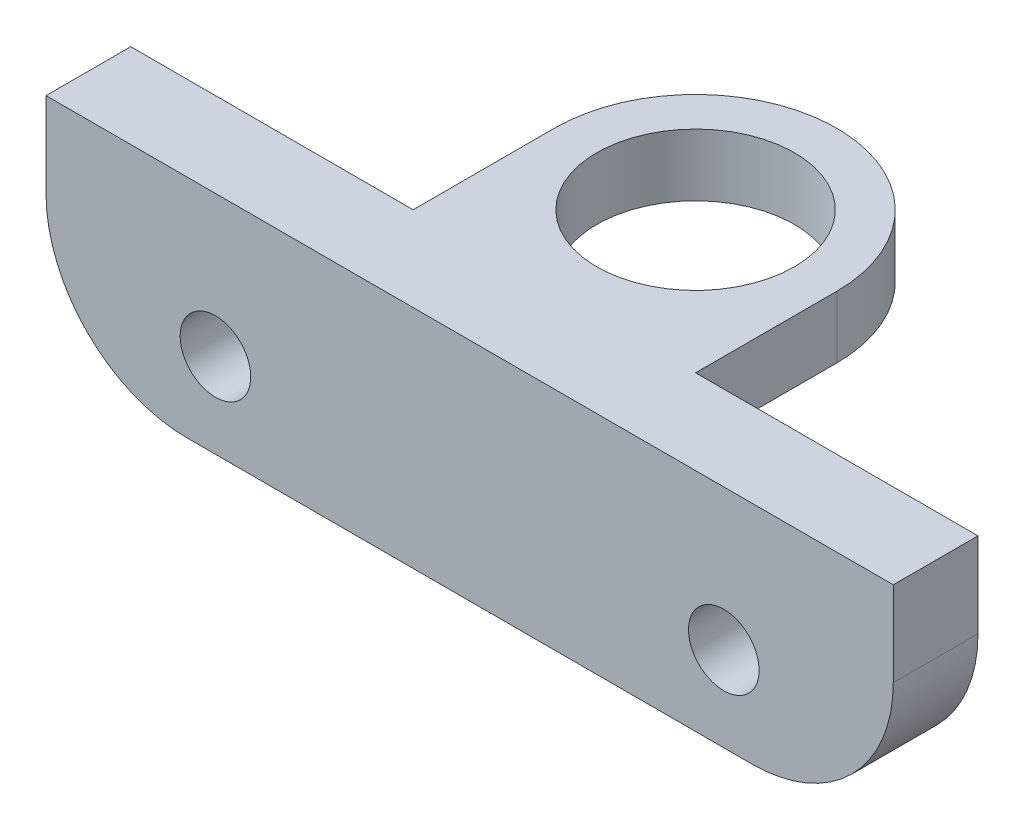
ISO-10303-21;
HEADER;
FILE_DESCRIPTION(('STEP AP214'),'2;1');
FILE_NAME('part.step','',(''),(''),'','','');
FILE_SCHEMA(('AUTOMOTIVE_DESIGN { 1 0 10303 214 1 1 1 1 }'));
ENDSEC;
DATA;
#1=APPLICATION_CONTEXT('core data for automotive mechanical design processes');
#2=APPLICATION_PROTOCOL_DEFINITION('international standard','automotive_design',2000,#1);
#3=PRODUCT_CONTEXT('',#1,'mechanical');
#4=PRODUCT('Part','Part','',(#3));
#5=PRODUCT_RELATED_PRODUCT_CATEGORY('part','',(#4));
#6=PRODUCT_DEFINITION_FORMATION('','',#4);
#7=PRODUCT_DEFINITION_CONTEXT('part definition',#1,'design');
#8=PRODUCT_DEFINITION('design','',#6,#7);
#9=PRODUCT_DEFINITION_SHAPE('','',#8);
#10=(LENGTH_UNIT() NAMED_UNIT(*) SI_UNIT(.MILLI.,.METRE.));
#11=(NAMED_UNIT(*) PLANE_ANGLE_UNIT() SI_UNIT($,.RADIAN.));
#12=(NAMED_UNIT(*) SI_UNIT($,.STERADIAN.) SOLID_ANGLE_UNIT());
#13=UNCERTAINTY_MEASURE_WITH_UNIT(LENGTH_MEASURE(1.E-05),#10,'distance_accuracy_value','');
#14=(GEOMETRIC_REPRESENTATION_CONTEXT(3) GLOBAL_UNCERTAINTY_ASSIGNED_CONTEXT((#13)) GLOBAL_UNIT_ASSIGNED_CONTEXT((#10,
#11,#12)) REPRESENTATION_CONTEXT('',''));
#15=CARTESIAN_POINT('',(0.,0.,0.));
#16=DIRECTION('',(0.,0.,1.));
#17=DIRECTION('',(1.,0.,0.));
#18=AXIS2_PLACEMENT_3D('',#15,#16,#17);
#19=CARTESIAN_POINT('',(4.99999999999955,649.332012286217,-374.357743681072));
#20=DIRECTION('',(0.,1.,0.));
#21=DIRECTION('',(0.,0.,1.));
#22=AXIS2_PLACEMENT_3D('',#19,#20,#21);
#23=PLANE('',#22);
#24=CARTESIAN_POINT('',(-4.53729523859855E-13,649.332012286217,-379.357743681072));
#25=DIRECTION('',(0.,-1.,0.));
#26=DIRECTION('',(1.,0.,0.));
#27=AXIS2_PLACEMENT_3D('',#24,#25,#26);
#28=CIRCLE('',#27,3.5);
#29=CARTESIAN_POINT('',(3.49999999999955,649.332012286217,-379.357743681072));
#30=VERTEX_POINT('',#29);
#31=EDGE_CURVE('E117',#30,#30,#28,.F.);
#32=ORIENTED_EDGE('',*,*,#31,.T.);
#33=EDGE_LOOP('',(#32));
#34=FACE_BOUND('',#33,.T.);
#35=DIRECTION('',(0.,0.,1.));
#36=VECTOR('',#35,1.);
#37=CARTESIAN_POINT('',(4.99999999999955,649.332012286217,-372.857743681072));
#38=LINE('',#37,#36);
#39=CARTESIAN_POINT('',(4.99999999999955,649.332012286217,-379.357743681072));
#40=VERTEX_POINT('',#39);
#41=CARTESIAN_POINT('',(4.99999999999955,649.332012286217,-374.357743681072));
#42=VERTEX_POINT('',#41);
#43=EDGE_CURVE('E100',#40,#42,#38,.T.);
#44=ORIENTED_EDGE('',*,*,#43,.T.);
#45=DIRECTION('',(1.,0.,0.));
#46=VECTOR('',#45,1.);
#47=CARTESIAN_POINT('',(-4.547474E-13,649.332012286217,-374.357743681072));
#48=LINE('',#47,#46);
#49=CARTESIAN_POINT('',(-5.00000000000045,649.332012286217,-374.357743681072));
#50=VERTEX_POINT('',#49);
#51=EDGE_CURVE('E97',#42,#50,#48,.F.);
#52=ORIENTED_EDGE('',*,*,#51,.T.);
#53=DIRECTION('',(0.,0.,-1.));
#54=VECTOR('',#53,1.);
#55=CARTESIAN_POINT('',(-5.00000000000045,649.332012286217,-372.857743681072));
#56=LINE('',#55,#54);
#57=CARTESIAN_POINT('',(-5.00000000000045,649.332012286217,-379.357743681072));
#58=VERTEX_POINT('',#57);
#59=EDGE_CURVE('E94',#50,#58,#56,.T.);
#60=ORIENTED_EDGE('',*,*,#59,.T.);
#61=CARTESIAN_POINT('',(-4.545085939E-13,649.332012286217,-379.357743681072));
#62=DIRECTION('',(0.,-1.,0.));
#63=DIRECTION('',(1.,0.,0.));
#64=AXIS2_PLACEMENT_3D('',#61,#62,#63);
#65=CIRCLE('',#64,5.);
#66=EDGE_CURVE('E20',#40,#58,#65,.F.);
#67=ORIENTED_EDGE('',*,*,#66,.F.);
#68=EDGE_LOOP('',(#44,#52,#60,#67));
#69=FACE_BOUND('',#68,.T.);
#70=ADVANCED_FACE('F17',(#34,#69),#23,.F.);
#71=CARTESIAN_POINT('',(4.99999999999955,647.532012286218,-372.857743681072));
#72=DIRECTION('',(-1.,0.,0.));
#73=DIRECTION('',(0.,0.,1.));
#74=AXIS2_PLACEMENT_3D('',#71,#72,#73);
#75=PLANE('',#74);
#76=DIRECTION('',(0.,0.,-1.));
#77=VECTOR('',#76,1.);
#78=CARTESIAN_POINT('',(4.99999999999955,651.532012286218,-372.857743681072));
#79=LINE('',#78,#77);
#80=CARTESIAN_POINT('',(4.99999999999955,651.532012286218,-379.357743681072));
#81=VERTEX_POINT('',#80);
#82=CARTESIAN_POINT('',(4.99999999999955,651.532012286218,-374.357743681072));
#83=VERTEX_POINT('',#82);
#84=EDGE_CURVE('E137',#81,#83,#79,.F.);
#85=ORIENTED_EDGE('',*,*,#84,.T.);
#86=DIRECTION('',(0.,1.,0.));
#87=VECTOR('',#86,1.);
#88=CARTESIAN_POINT('',(4.99999999999955,647.532012286218,-374.357743681072));
#89=LINE('',#88,#87);
#90=EDGE_CURVE('E120',#83,#42,#89,.F.);
#91=ORIENTED_EDGE('',*,*,#90,.T.);
#92=ORIENTED_EDGE('',*,*,#43,.F.);
#93=DIRECTION('',(0.,-1.,0.));
#94=VECTOR('',#93,1.);
#95=CARTESIAN_POINT('',(4.99999999999955,648.032012286217,-379.357743681072));
#96=LINE('',#95,#94);
#97=EDGE_CURVE('E110',#81,#40,#96,.T.);
#98=ORIENTED_EDGE('',*,*,#97,.F.);
#99=EDGE_LOOP('',(#85,#91,#92,#98));
#100=FACE_BOUND('',#99,.T.);
#101=ADVANCED_FACE('F296',(#100),#75,.F.);
#102=CARTESIAN_POINT('',(-5.00000000000045,647.532012286218,-372.857743681072));
#103=DIRECTION('',(1.,0.,0.));
#104=DIRECTION('',(0.,0.,-1.));
#105=AXIS2_PLACEMENT_3D('',#102,#103,#104);
#106=PLANE('',#105);
#107=ORIENTED_EDGE('',*,*,#59,.F.);
#108=DIRECTION('',(0.,1.,0.));
#109=VECTOR('',#108,1.);
#110=CARTESIAN_POINT('',(-5.00000000000045,647.532012286218,-374.357743681072));
#111=LINE('',#110,#109);
#112=CARTESIAN_POINT('',(-5.00000000000045,651.532012286218,-374.357743681072));
#113=VERTEX_POINT('',#112);
#114=EDGE_CURVE('E123',#50,#113,#111,.T.);
#115=ORIENTED_EDGE('',*,*,#114,.T.);
#116=DIRECTION('',(0.,0.,-1.));
#117=VECTOR('',#116,1.);
#118=CARTESIAN_POINT('',(-5.00000000000045,651.532012286218,-372.857743681072));
#119=LINE('',#118,#117);
#120=CARTESIAN_POINT('',(-5.00000000000045,651.532012286218,-379.357743681072));
#121=VERTEX_POINT('',#120);
#122=EDGE_CURVE('E106',#113,#121,#119,.T.);
#123=ORIENTED_EDGE('',*,*,#122,.T.);
#124=DIRECTION('',(0.,-1.,0.));
#125=VECTOR('',#124,1.);
#126=CARTESIAN_POINT('',(-5.00000000000045,648.032012286217,-379.357743681072));
#127=LINE('',#126,#125);
#128=EDGE_CURVE('E103',#58,#121,#127,.F.);
#129=ORIENTED_EDGE('',*,*,#128,.F.);
#130=EDGE_LOOP('',(#107,#115,#123,#129));
#131=FACE_BOUND('',#130,.T.);
#132=ADVANCED_FACE('F104',(#131),#106,.F.);
#133=CARTESIAN_POINT('',(-4.547474E-13,648.032012286217,-379.357743681072));
#134=DIRECTION('',(0.,-1.,0.));
#135=DIRECTION('',(1.,0.,0.));
#136=AXIS2_PLACEMENT_3D('',#133,#134,#135);
#137=CYLINDRICAL_SURFACE('',#136,5.);
#138=CARTESIAN_POINT('',(-4.541044605E-13,651.532012286218,-379.357743681072));
#139=DIRECTION('',(0.,-1.,0.));
#140=DIRECTION('',(1.,0.,0.));
#141=AXIS2_PLACEMENT_3D('',#138,#139,#140);
#142=CIRCLE('',#141,5.);
#143=EDGE_CURVE('E114',#121,#81,#142,.T.);
#144=ORIENTED_EDGE('',*,*,#143,.T.);
#145=ORIENTED_EDGE('',*,*,#97,.T.);
#146=ORIENTED_EDGE('',*,*,#66,.T.);
#147=ORIENTED_EDGE('',*,*,#128,.T.);
#148=EDGE_LOOP('',(#144,#145,#146,#147));
#149=FACE_BOUND('',#148,.T.);
#150=ADVANCED_FACE('F113',(#149),#137,.T.);
#151=CARTESIAN_POINT('',(-4.547474E-13,643.790952061252,-379.357743681072));
#152=DIRECTION('',(0.,-1.,0.));
#153=DIRECTION('',(1.,0.,0.));
#154=AXIS2_PLACEMENT_3D('',#151,#152,#153);
#155=CYLINDRICAL_SURFACE('',#154,3.5);
#156=ORIENTED_EDGE('',*,*,#31,.F.);
#157=EDGE_LOOP('',(#156));
#158=FACE_BOUND('',#157,.T.);
#159=CARTESIAN_POINT('',(-4.53325390459854E-13,651.532012286218,-379.357743681072));
#160=DIRECTION('',(0.,-1.,0.));
#161=DIRECTION('',(1.,0.,0.));
#162=AXIS2_PLACEMENT_3D('',#159,#160,#161);
#163=CIRCLE('',#162,3.5);
#164=CARTESIAN_POINT('',(3.49999999999955,651.532012286218,-379.357743681072));
#165=VERTEX_POINT('',#164);
#166=EDGE_CURVE('E173',#165,#165,#163,.F.);
#167=ORIENTED_EDGE('',*,*,#166,.T.);
#168=EDGE_LOOP('',(#167));
#169=FACE_BOUND('',#168,.T.);
#170=ADVANCED_FACE('F281',(#158,#169),#155,.F.);
#171=CARTESIAN_POINT('',(-4.547474E-13,647.532012286218,-374.357743681072));
#172=DIRECTION('',(0.,0.,1.));
#173=DIRECTION('',(1.,0.,0.));
#174=AXIS2_PLACEMENT_3D('',#171,#172,#173);
#175=PLANE('',#174);
#176=CARTESIAN_POINT('',(-9.00000000000045,646.532012286218,-374.357743681072));
#177=DIRECTION('',(0.,0.,-1.));
#178=DIRECTION('',(-1.,0.,0.));
#179=AXIS2_PLACEMENT_3D('',#176,#177,#178);
#180=CIRCLE('',#179,1.25);
#181=CARTESIAN_POINT('',(-10.2500000000004,646.532012286218,-374.357743681072));
#182=VERTEX_POINT('',#181);
#183=EDGE_CURVE('E169',#182,#182,#180,.F.);
#184=ORIENTED_EDGE('',*,*,#183,.T.);
#185=EDGE_LOOP('',(#184));
#186=FACE_BOUND('',#185,.T.);
#187=CARTESIAN_POINT('',(8.99999999999955,646.532012286218,-374.357743681072));
#188=DIRECTION('',(0.,0.,-1.));
#189=DIRECTION('',(-1.,0.,0.));
#190=AXIS2_PLACEMENT_3D('',#187,#188,#189);
#191=CIRCLE('',#190,1.25);
#192=CARTESIAN_POINT('',(7.74999999999955,646.532012286218,-374.357743681072));
#193=VERTEX_POINT('',#192);
#194=EDGE_CURVE('E166',#193,#193,#191,.F.);
#195=ORIENTED_EDGE('',*,*,#194,.T.);
#196=EDGE_LOOP('',(#195));
#197=FACE_BOUND('',#196,.T.);
#198=DIRECTION('',(0.,1.,0.));
#199=VECTOR('',#198,1.);
#200=CARTESIAN_POINT('',(-15.0000000000005,647.532012286218,-374.357743681072));
#201=LINE('',#200,#199);
#202=CARTESIAN_POINT('',(-15.0000000000005,648.532012286218,-374.357743681072));
#203=VERTEX_POINT('',#202);
#204=CARTESIAN_POINT('',(-15.0000000000005,651.532012286218,-374.357743681072));
#205=VERTEX_POINT('',#204);
#206=EDGE_CURVE('E176',#203,#205,#201,.T.);
#207=ORIENTED_EDGE('',*,*,#206,.T.);
#208=DIRECTION('',(1.,0.,0.));
#209=VECTOR('',#208,1.);
#210=CARTESIAN_POINT('',(-4.547474E-13,651.532012286218,-374.357743681072));
#211=LINE('',#210,#209);
#212=EDGE_CURVE('E202',#205,#113,#211,.T.);
#213=ORIENTED_EDGE('',*,*,#212,.T.);
#214=ORIENTED_EDGE('',*,*,#114,.F.);
#215=ORIENTED_EDGE('',*,*,#51,.F.);
#216=ORIENTED_EDGE('',*,*,#90,.F.);
#217=DIRECTION('',(1.,0.,0.));
#218=VECTOR('',#217,1.);
#219=CARTESIAN_POINT('',(-4.547474E-13,651.532012286218,-374.357743681072));
#220=LINE('',#219,#218);
#221=CARTESIAN_POINT('',(14.9999999999995,651.532012286218,-374.357743681072));
#222=VERTEX_POINT('',#221);
#223=EDGE_CURVE('E134',#83,#222,#220,.T.);
#224=ORIENTED_EDGE('',*,*,#223,.T.);
#225=DIRECTION('',(0.,1.,0.));
#226=VECTOR('',#225,1.);
#227=CARTESIAN_POINT('',(14.9999999999995,647.532012286218,-374.357743681072));
#228=LINE('',#227,#226);
#229=CARTESIAN_POINT('',(14.9999999999995,648.532012286218,-374.357743681072));
#230=VERTEX_POINT('',#229);
#231=EDGE_CURVE('E128',#222,#230,#228,.F.);
#232=ORIENTED_EDGE('',*,*,#231,.T.);
#233=CARTESIAN_POINT('',(9.99999999999955,648.532012286218,-374.357743681072));
#234=DIRECTION('',(0.,0.,-1.));
#235=DIRECTION('',(-1.,0.,0.));
#236=AXIS2_PLACEMENT_3D('',#233,#234,#235);
#237=CIRCLE('',#236,5.);
#238=CARTESIAN_POINT('',(9.99999999999955,643.532012286218,-374.357743681072));
#239=VERTEX_POINT('',#238);
#240=EDGE_CURVE('E178',#239,#230,#237,.F.);
#241=ORIENTED_EDGE('',*,*,#240,.F.);
#242=DIRECTION('',(1.,0.,0.));
#243=VECTOR('',#242,1.);
#244=CARTESIAN_POINT('',(-4.547474E-13,643.532012286218,-374.357743681072));
#245=LINE('',#244,#243);
#246=CARTESIAN_POINT('',(-10.0000000000005,643.532012286218,-374.357743681072));
#247=VERTEX_POINT('',#246);
#248=EDGE_CURVE('E144',#239,#247,#245,.F.);
#249=ORIENTED_EDGE('',*,*,#248,.T.);
#250=CARTESIAN_POINT('',(-10.0000000000005,648.532012286218,-374.357743681072));
#251=DIRECTION('',(0.,0.,-1.));
#252=DIRECTION('',(-1.,0.,0.));
#253=AXIS2_PLACEMENT_3D('',#250,#251,#252);
#254=CIRCLE('',#253,5.);
#255=EDGE_CURVE('E125',#203,#247,#254,.F.);
#256=ORIENTED_EDGE('',*,*,#255,.F.);
#257=EDGE_LOOP('',(#207,#213,#214,#215,#216,#224,#232,#241,#249,#256));
#258=FACE_BOUND('',#257,.T.);
#259=ADVANCED_FACE('F244',(#186,#197,#258),#175,.F.);
#260=CARTESIAN_POINT('',(-10.0000000000005,648.532012286218,-372.857743681072));
#261=DIRECTION('',(0.,0.,-1.));
#262=DIRECTION('',(-1.,0.,0.));
#263=AXIS2_PLACEMENT_3D('',#260,#261,#262);
#264=CYLINDRICAL_SURFACE('',#263,5.);
#265=CARTESIAN_POINT('',(-10.0000000000005,648.532012286218,-371.357743681072));
#266=DIRECTION('',(0.,0.,-1.));
#267=DIRECTION('',(-1.,0.,0.));
#268=AXIS2_PLACEMENT_3D('',#265,#266,#267);
#269=CIRCLE('',#268,5.);
#270=CARTESIAN_POINT('',(-15.0000000000005,648.532012286218,-371.357743681072));
#271=VERTEX_POINT('',#270);
#272=CARTESIAN_POINT('',(-10.0000000000005,643.532012286218,-371.357743681072));
#273=VERTEX_POINT('',#272);
#274=EDGE_CURVE('E163',#271,#273,#269,.F.);
#275=ORIENTED_EDGE('',*,*,#274,.F.);
#276=DIRECTION('',(0.,0.,-1.));
#277=VECTOR('',#276,1.);
#278=CARTESIAN_POINT('',(-15.0000000000005,648.532012286218,-372.857743681072));
#279=LINE('',#278,#277);
#280=EDGE_CURVE('E172',#271,#203,#279,.T.);
#281=ORIENTED_EDGE('',*,*,#280,.T.);
#282=ORIENTED_EDGE('',*,*,#255,.T.);
#283=DIRECTION('',(0.,0.,1.));
#284=VECTOR('',#283,1.);
#285=CARTESIAN_POINT('',(-10.0000000000005,643.532012286218,-372.857743681072));
#286=LINE('',#285,#284);
#287=EDGE_CURVE('E145',#247,#273,#286,.T.);
#288=ORIENTED_EDGE('',*,*,#287,.T.);
#289=EDGE_LOOP('',(#275,#281,#282,#288));
#290=FACE_BOUND('',#289,.T.);
#291=ADVANCED_FACE('F185',(#290),#264,.T.);
#292=CARTESIAN_POINT('',(-4.547474E-13,643.532012286218,-372.857743681072));
#293=DIRECTION('',(0.,1.,0.));
#294=DIRECTION('',(0.,0.,1.));
#295=AXIS2_PLACEMENT_3D('',#292,#293,#294);
#296=PLANE('',#295);
#297=ORIENTED_EDGE('',*,*,#248,.F.);
#298=DIRECTION('',(0.,0.,-1.));
#299=VECTOR('',#298,1.);
#300=CARTESIAN_POINT('',(9.99999999999955,643.532012286218,-372.857743681072));
#301=LINE('',#300,#299);
#302=CARTESIAN_POINT('',(9.99999999999955,643.532012286218,-371.357743681072));
#303=VERTEX_POINT('',#302);
#304=EDGE_CURVE('E131',#303,#239,#301,.T.);
#305=ORIENTED_EDGE('',*,*,#304,.F.);
#306=DIRECTION('',(1.,0.,0.));
#307=VECTOR('',#306,1.);
#308=CARTESIAN_POINT('',(-4.547474E-13,643.532012286218,-371.357743681072));
#309=LINE('',#308,#307);
#310=EDGE_CURVE('E162',#273,#303,#309,.T.);
#311=ORIENTED_EDGE('',*,*,#310,.F.);
#312=ORIENTED_EDGE('',*,*,#287,.F.);
#313=EDGE_LOOP('',(#297,#305,#311,#312));
#314=FACE_BOUND('',#313,.T.);
#315=ADVANCED_FACE('F192',(#314),#296,.F.);
#316=CARTESIAN_POINT('',(9.99999999999955,648.532012286218,-372.857743681072));
#317=DIRECTION('',(0.,0.,-1.));
#318=DIRECTION('',(-1.,0.,0.));
#319=AXIS2_PLACEMENT_3D('',#316,#317,#318);
#320=CYLINDRICAL_SURFACE('',#319,5.);
#321=CARTESIAN_POINT('',(9.99999999999955,648.532012286218,-371.357743681072));
#322=DIRECTION('',(0.,0.,-1.));
#323=DIRECTION('',(-1.,0.,0.));
#324=AXIS2_PLACEMENT_3D('',#321,#322,#323);
#325=CIRCLE('',#324,5.);
#326=CARTESIAN_POINT('',(14.9999999999995,648.532012286218,-371.357743681072));
#327=VERTEX_POINT('',#326);
#328=EDGE_CURVE('E158',#303,#327,#325,.F.);
#329=ORIENTED_EDGE('',*,*,#328,.F.);
#330=ORIENTED_EDGE('',*,*,#304,.T.);
#331=ORIENTED_EDGE('',*,*,#240,.T.);
#332=DIRECTION('',(0.,0.,1.));
#333=VECTOR('',#332,1.);
#334=CARTESIAN_POINT('',(14.9999999999995,648.532012286218,-372.857743681072));
#335=LINE('',#334,#333);
#336=EDGE_CURVE('E130',#230,#327,#335,.T.);
#337=ORIENTED_EDGE('',*,*,#336,.T.);
#338=EDGE_LOOP('',(#329,#330,#331,#337));
#339=FACE_BOUND('',#338,.T.);
#340=ADVANCED_FACE('F248',(#339),#320,.T.);
#341=CARTESIAN_POINT('',(14.9999999999995,647.532012286218,-372.857743681072));
#342=DIRECTION('',(-1.,0.,0.));
#343=DIRECTION('',(0.,0.,1.));
#344=AXIS2_PLACEMENT_3D('',#341,#342,#343);
#345=PLANE('',#344);
#346=ORIENTED_EDGE('',*,*,#231,.F.);
#347=DIRECTION('',(0.,0.,-1.));
#348=VECTOR('',#347,1.);
#349=CARTESIAN_POINT('',(14.9999999999995,651.532012286218,-372.857743681072));
#350=LINE('',#349,#348);
#351=CARTESIAN_POINT('',(14.9999999999995,651.532012286218,-371.357743681072));
#352=VERTEX_POINT('',#351);
#353=EDGE_CURVE('E136',#222,#352,#350,.F.);
#354=ORIENTED_EDGE('',*,*,#353,.T.);
#355=DIRECTION('',(0.,1.,0.));
#356=VECTOR('',#355,1.);
#357=CARTESIAN_POINT('',(14.9999999999995,647.532012286218,-371.357743681072));
#358=LINE('',#357,#356);
#359=EDGE_CURVE('E161',#327,#352,#358,.T.);
#360=ORIENTED_EDGE('',*,*,#359,.F.);
#361=ORIENTED_EDGE('',*,*,#336,.F.);
#362=EDGE_LOOP('',(#346,#354,#360,#361));
#363=FACE_BOUND('',#362,.T.);
#364=ADVANCED_FACE('F247',(#363),#345,.F.);
#365=CARTESIAN_POINT('',(-4.547474E-13,651.532012286218,-372.857743681072));
#366=DIRECTION('',(0.,-1.,0.));
#367=DIRECTION('',(0.,0.,-1.));
#368=AXIS2_PLACEMENT_3D('',#365,#366,#367);
#369=PLANE('',#368);
#370=ORIENTED_EDGE('',*,*,#166,.F.);
#371=EDGE_LOOP('',(#370));
#372=FACE_BOUND('',#371,.T.);
#373=ORIENTED_EDGE('',*,*,#122,.F.);
#374=ORIENTED_EDGE('',*,*,#212,.F.);
#375=DIRECTION('',(0.,0.,-1.));
#376=VECTOR('',#375,1.);
#377=CARTESIAN_POINT('',(-15.0000000000005,651.532012286218,-372.857743681072));
#378=LINE('',#377,#376);
#379=CARTESIAN_POINT('',(-15.0000000000005,651.532012286218,-371.357743681072));
#380=VERTEX_POINT('',#379);
#381=EDGE_CURVE('E35',#205,#380,#378,.F.);
#382=ORIENTED_EDGE('',*,*,#381,.T.);
#383=DIRECTION('',(1.,0.,0.));
#384=VECTOR('',#383,1.);
#385=CARTESIAN_POINT('',(-4.547474E-13,651.532012286218,-371.357743681072));
#386=LINE('',#385,#384);
#387=EDGE_CURVE('E225',#352,#380,#386,.F.);
#388=ORIENTED_EDGE('',*,*,#387,.F.);
#389=ORIENTED_EDGE('',*,*,#353,.F.);
#390=ORIENTED_EDGE('',*,*,#223,.F.);
#391=ORIENTED_EDGE('',*,*,#84,.F.);
#392=ORIENTED_EDGE('',*,*,#143,.F.);
#393=EDGE_LOOP('',(#373,#374,#382,#388,#389,#390,#391,#392));
#394=FACE_BOUND('',#393,.T.);
#395=ADVANCED_FACE('F245',(#372,#394),#369,.F.);
#396=CARTESIAN_POINT('',(-15.0000000000005,647.532012286218,-372.857743681072));
#397=DIRECTION('',(1.,0.,0.));
#398=DIRECTION('',(0.,0.,-1.));
#399=AXIS2_PLACEMENT_3D('',#396,#397,#398);
#400=PLANE('',#399);
#401=DIRECTION('',(0.,1.,0.));
#402=VECTOR('',#401,1.);
#403=CARTESIAN_POINT('',(-15.0000000000005,647.532012286218,-371.357743681072));
#404=LINE('',#403,#402);
#405=EDGE_CURVE('E157',#380,#271,#404,.F.);
#406=ORIENTED_EDGE('',*,*,#405,.F.);
#407=ORIENTED_EDGE('',*,*,#381,.F.);
#408=ORIENTED_EDGE('',*,*,#206,.F.);
#409=ORIENTED_EDGE('',*,*,#280,.F.);
#410=EDGE_LOOP('',(#406,#407,#408,#409));
#411=FACE_BOUND('',#410,.T.);
#412=ADVANCED_FACE('F243',(#411),#400,.F.);
#413=CARTESIAN_POINT('',(-9.00000000000045,646.532012286218,-372.857743681072));
#414=DIRECTION('',(0.,0.,-1.));
#415=DIRECTION('',(-1.,0.,0.));
#416=AXIS2_PLACEMENT_3D('',#413,#414,#415);
#417=CYLINDRICAL_SURFACE('',#416,1.25);
#418=CARTESIAN_POINT('',(-9.00000000000045,646.532012286218,-371.357743681072));
#419=DIRECTION('',(0.,0.,-1.));
#420=DIRECTION('',(-1.,0.,0.));
#421=AXIS2_PLACEMENT_3D('',#418,#419,#420);
#422=CIRCLE('',#421,1.25);
#423=CARTESIAN_POINT('',(-10.2500000000004,646.532012286218,-371.357743681072));
#424=VERTEX_POINT('',#423);
#425=EDGE_CURVE('E26',#424,#424,#422,.T.);
#426=ORIENTED_EDGE('',*,*,#425,.F.);
#427=EDGE_LOOP('',(#426));
#428=FACE_BOUND('',#427,.T.);
#429=ORIENTED_EDGE('',*,*,#183,.F.);
#430=EDGE_LOOP('',(#429));
#431=FACE_BOUND('',#430,.T.);
#432=ADVANCED_FACE('F265',(#428,#431),#417,.F.);
#433=CARTESIAN_POINT('',(8.99999999999955,646.532012286218,-372.857743681072));
#434=DIRECTION('',(0.,0.,-1.));
#435=DIRECTION('',(-1.,0.,0.));
#436=AXIS2_PLACEMENT_3D('',#433,#434,#435);
#437=CYLINDRICAL_SURFACE('',#436,1.25);
#438=CARTESIAN_POINT('',(8.99999999999955,646.532012286218,-371.357743681072));
#439=DIRECTION('',(0.,0.,-1.));
#440=DIRECTION('',(-1.,0.,0.));
#441=AXIS2_PLACEMENT_3D('',#438,#439,#440);
#442=CIRCLE('',#441,1.25);
#443=CARTESIAN_POINT('',(7.74999999999955,646.532012286218,-371.357743681072));
#444=VERTEX_POINT('',#443);
#445=EDGE_CURVE('E11',#444,#444,#442,.T.);
#446=ORIENTED_EDGE('',*,*,#445,.F.);
#447=EDGE_LOOP('',(#446));
#448=FACE_BOUND('',#447,.T.);
#449=ORIENTED_EDGE('',*,*,#194,.F.);
#450=EDGE_LOOP('',(#449));
#451=FACE_BOUND('',#450,.T.);
#452=ADVANCED_FACE('F259',(#448,#451),#437,.F.);
#453=CARTESIAN_POINT('',(-4.547474E-13,647.532012286218,-371.357743681072));
#454=DIRECTION('',(0.,0.,1.));
#455=DIRECTION('',(1.,0.,0.));
#456=AXIS2_PLACEMENT_3D('',#453,#454,#455);
#457=PLANE('',#456);
#458=ORIENTED_EDGE('',*,*,#445,.T.);
#459=EDGE_LOOP('',(#458));
#460=FACE_BOUND('',#459,.T.);
#461=ORIENTED_EDGE('',*,*,#425,.T.);
#462=EDGE_LOOP('',(#461));
#463=FACE_BOUND('',#462,.T.);
#464=ORIENTED_EDGE('',*,*,#387,.T.);
#465=ORIENTED_EDGE('',*,*,#405,.T.);
#466=ORIENTED_EDGE('',*,*,#274,.T.);
#467=ORIENTED_EDGE('',*,*,#310,.T.);
#468=ORIENTED_EDGE('',*,*,#328,.T.);
#469=ORIENTED_EDGE('',*,*,#359,.T.);
#470=EDGE_LOOP('',(#464,#465,#466,#467,#468,#469));
#471=FACE_BOUND('',#470,.T.);
#472=ADVANCED_FACE('F241',(#460,#463,#471),#457,.T.);
#473=CLOSED_SHELL('',(#70,#101,#132,#150,#170,#259,#291,#315,#340,#364,#395,#412,#432,#452,#472));
#474=MANIFOLD_SOLID_BREP('B1',#473);
#475=ADVANCED_BREP_SHAPE_REPRESENTATION('',(#18,#474),#14);
#476=SHAPE_DEFINITION_REPRESENTATION(#9,#475);
ENDSEC;
END-ISO-10303-21;
